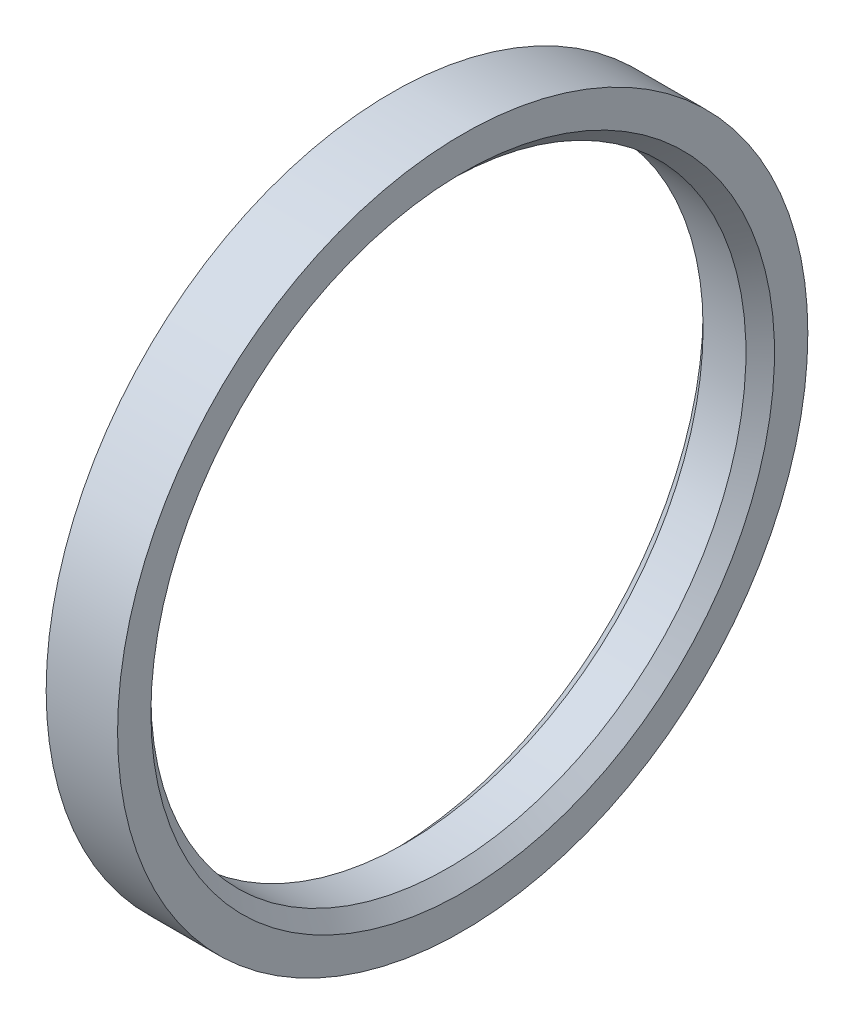
ISO-10303-21;
HEADER;
FILE_DESCRIPTION(('STEP AP214'),'2;1');
FILE_NAME('part.step','',(''),(''),'','','');
FILE_SCHEMA(('AUTOMOTIVE_DESIGN { 1 0 10303 214 1 1 1 1 }'));
ENDSEC;
DATA;
#1=APPLICATION_CONTEXT('core data for automotive mechanical design processes');
#2=APPLICATION_PROTOCOL_DEFINITION('international standard','automotive_design',2000,#1);
#3=PRODUCT_CONTEXT('',#1,'mechanical');
#4=PRODUCT('Part','Part','',(#3));
#5=PRODUCT_RELATED_PRODUCT_CATEGORY('part','',(#4));
#6=PRODUCT_DEFINITION_FORMATION('','',#4);
#7=PRODUCT_DEFINITION_CONTEXT('part definition',#1,'design');
#8=PRODUCT_DEFINITION('design','',#6,#7);
#9=PRODUCT_DEFINITION_SHAPE('','',#8);
#10=(LENGTH_UNIT() NAMED_UNIT(*) SI_UNIT(.MILLI.,.METRE.));
#11=(NAMED_UNIT(*) PLANE_ANGLE_UNIT() SI_UNIT($,.RADIAN.));
#12=(NAMED_UNIT(*) SI_UNIT($,.STERADIAN.) SOLID_ANGLE_UNIT());
#13=UNCERTAINTY_MEASURE_WITH_UNIT(LENGTH_MEASURE(1.E-05),#10,'distance_accuracy_value','');
#14=(GEOMETRIC_REPRESENTATION_CONTEXT(3) GLOBAL_UNCERTAINTY_ASSIGNED_CONTEXT((#13)) GLOBAL_UNIT_ASSIGNED_CONTEXT((#10,
#11,#12)) REPRESENTATION_CONTEXT('',''));
#15=CARTESIAN_POINT('',(0.,0.,0.));
#16=DIRECTION('',(0.,0.,1.));
#17=DIRECTION('',(1.,0.,0.));
#18=AXIS2_PLACEMENT_3D('',#15,#16,#17);
#19=CARTESIAN_POINT('',(0.,0.,0.));
#20=DIRECTION('',(-1.,0.,0.));
#21=DIRECTION('',(0.,0.,1.));
#22=AXIS2_PLACEMENT_3D('',#19,#20,#21);
#23=CYLINDRICAL_SURFACE('',#22,14.5);
#24=CARTESIAN_POINT('',(0.,0.,0.));
#25=DIRECTION('',(-1.,0.,0.));
#26=DIRECTION('',(0.,0.,1.));
#27=AXIS2_PLACEMENT_3D('',#24,#25,#26);
#28=CIRCLE('',#27,14.5);
#29=CARTESIAN_POINT('',(0.,0.,14.5));
#30=VERTEX_POINT('',#29);
#31=EDGE_CURVE('E53',#30,#30,#28,.T.);
#32=ORIENTED_EDGE('',*,*,#31,.F.);
#33=EDGE_LOOP('',(#32));
#34=FACE_BOUND('',#33,.T.);
#35=CARTESIAN_POINT('',(3.,0.,0.));
#36=DIRECTION('',(-1.,0.,0.));
#37=DIRECTION('',(0.,0.,1.));
#38=AXIS2_PLACEMENT_3D('',#35,#36,#37);
#39=CIRCLE('',#38,14.5);
#40=CARTESIAN_POINT('',(3.,0.,14.5));
#41=VERTEX_POINT('',#40);
#42=EDGE_CURVE('E56',#41,#41,#39,.T.);
#43=ORIENTED_EDGE('',*,*,#42,.T.);
#44=EDGE_LOOP('',(#43));
#45=FACE_BOUND('',#44,.T.);
#46=ADVANCED_FACE('F33',(#34,#45),#23,.T.);
#47=CARTESIAN_POINT('',(0.,14.5,0.));
#48=DIRECTION('',(1.,0.,0.));
#49=DIRECTION('',(0.,0.,-1.));
#50=AXIS2_PLACEMENT_3D('',#47,#48,#49);
#51=PLANE('',#50);
#52=CARTESIAN_POINT('',(0.,0.,0.));
#53=DIRECTION('',(1.,0.,0.));
#54=DIRECTION('',(0.,0.,-1.));
#55=AXIS2_PLACEMENT_3D('',#52,#53,#54);
#56=CIRCLE('',#55,13.1);
#57=CARTESIAN_POINT('',(0.,0.,-13.1));
#58=VERTEX_POINT('',#57);
#59=EDGE_CURVE('E10',#58,#58,#56,.T.);
#60=ORIENTED_EDGE('',*,*,#59,.T.);
#61=EDGE_LOOP('',(#60));
#62=FACE_BOUND('',#61,.T.);
#63=ORIENTED_EDGE('',*,*,#31,.T.);
#64=EDGE_LOOP('',(#63));
#65=FACE_BOUND('',#64,.T.);
#66=ADVANCED_FACE('F72',(#62,#65),#51,.F.);
#67=CARTESIAN_POINT('',(0.,0.,0.));
#68=DIRECTION('',(-1.,0.,0.));
#69=DIRECTION('',(0.,0.,1.));
#70=AXIS2_PLACEMENT_3D('',#67,#68,#69);
#71=CYLINDRICAL_SURFACE('',#70,12.5);
#72=CARTESIAN_POINT('',(2.4,0.,0.));
#73=DIRECTION('',(-1.,0.,0.));
#74=DIRECTION('',(0.,0.,1.));
#75=AXIS2_PLACEMENT_3D('',#72,#73,#74);
#76=CIRCLE('',#75,12.5);
#77=CARTESIAN_POINT('',(2.4,0.,12.5));
#78=VERTEX_POINT('',#77);
#79=EDGE_CURVE('E40',#78,#78,#76,.F.);
#80=ORIENTED_EDGE('',*,*,#79,.T.);
#81=EDGE_LOOP('',(#80));
#82=FACE_BOUND('',#81,.T.);
#83=CARTESIAN_POINT('',(0.599999999999998,0.,0.));
#84=DIRECTION('',(1.,0.,0.));
#85=DIRECTION('',(0.,0.,-1.));
#86=AXIS2_PLACEMENT_3D('',#83,#84,#85);
#87=CIRCLE('',#86,12.5);
#88=CARTESIAN_POINT('',(0.599999999999998,0.,-12.5));
#89=VERTEX_POINT('',#88);
#90=EDGE_CURVE('E44',#89,#89,#87,.F.);
#91=ORIENTED_EDGE('',*,*,#90,.T.);
#92=EDGE_LOOP('',(#91));
#93=FACE_BOUND('',#92,.T.);
#94=ADVANCED_FACE('F64',(#82,#93),#71,.F.);
#95=CARTESIAN_POINT('',(3.,12.5,0.));
#96=DIRECTION('',(-1.,0.,0.));
#97=DIRECTION('',(0.,0.,1.));
#98=AXIS2_PLACEMENT_3D('',#95,#96,#97);
#99=PLANE('',#98);
#100=CARTESIAN_POINT('',(3.,0.,0.));
#101=DIRECTION('',(-1.,0.,0.));
#102=DIRECTION('',(0.,0.,1.));
#103=AXIS2_PLACEMENT_3D('',#100,#101,#102);
#104=CIRCLE('',#103,13.1);
#105=CARTESIAN_POINT('',(3.,0.,13.1));
#106=VERTEX_POINT('',#105);
#107=EDGE_CURVE('E48',#106,#106,#104,.T.);
#108=ORIENTED_EDGE('',*,*,#107,.T.);
#109=EDGE_LOOP('',(#108));
#110=FACE_BOUND('',#109,.T.);
#111=ORIENTED_EDGE('',*,*,#42,.F.);
#112=EDGE_LOOP('',(#111));
#113=FACE_BOUND('',#112,.T.);
#114=ADVANCED_FACE('F61',(#110,#113),#99,.F.);
#115=CARTESIAN_POINT('',(3.,0.,0.));
#116=DIRECTION('',(1.,0.,0.));
#117=DIRECTION('',(0.,0.,-1.));
#118=AXIS2_PLACEMENT_3D('',#115,#116,#117);
#119=CONICAL_SURFACE('',#118,13.1,0.785398163397447);
#120=ORIENTED_EDGE('',*,*,#79,.F.);
#121=EDGE_LOOP('',(#120));
#122=FACE_BOUND('',#121,.T.);
#123=ORIENTED_EDGE('',*,*,#107,.F.);
#124=EDGE_LOOP('',(#123));
#125=FACE_BOUND('',#124,.T.);
#126=ADVANCED_FACE('F63',(#122,#125),#119,.F.);
#127=CARTESIAN_POINT('',(0.599999999999998,0.,0.));
#128=DIRECTION('',(-1.,0.,0.));
#129=DIRECTION('',(0.,0.,1.));
#130=AXIS2_PLACEMENT_3D('',#127,#128,#129);
#131=CONICAL_SURFACE('',#130,12.5,0.78539816339745);
#132=ORIENTED_EDGE('',*,*,#59,.F.);
#133=EDGE_LOOP('',(#132));
#134=FACE_BOUND('',#133,.T.);
#135=ORIENTED_EDGE('',*,*,#90,.F.);
#136=EDGE_LOOP('',(#135));
#137=FACE_BOUND('',#136,.T.);
#138=ADVANCED_FACE('F35',(#134,#137),#131,.F.);
#139=CLOSED_SHELL('',(#46,#66,#94,#114,#126,#138));
#140=MANIFOLD_SOLID_BREP('B2',#139);
#141=ADVANCED_BREP_SHAPE_REPRESENTATION('',(#18,#140),#14);
#142=SHAPE_DEFINITION_REPRESENTATION(#9,#141);
ENDSEC;
END-ISO-10303-21;
